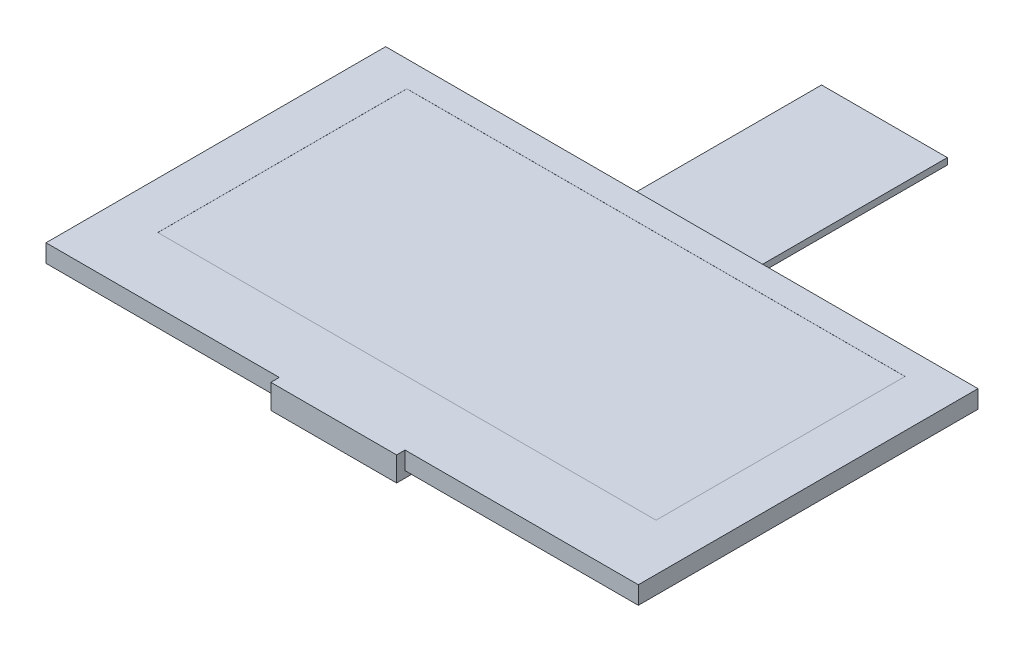
ISO-10303-21;
HEADER;
FILE_DESCRIPTION(('STEP AP214'),'2;1');
FILE_NAME('part.step','',(''),(''),'','','');
FILE_SCHEMA(('AUTOMOTIVE_DESIGN { 1 0 10303 214 1 1 1 1 }'));
ENDSEC;
DATA;
#1=APPLICATION_CONTEXT('core data for automotive mechanical design processes');
#2=APPLICATION_PROTOCOL_DEFINITION('international standard','automotive_design',2000,#1);
#3=PRODUCT_CONTEXT('',#1,'mechanical');
#4=PRODUCT('Part','Part','',(#3));
#5=PRODUCT_RELATED_PRODUCT_CATEGORY('part','',(#4));
#6=PRODUCT_DEFINITION_FORMATION('','',#4);
#7=PRODUCT_DEFINITION_CONTEXT('part definition',#1,'design');
#8=PRODUCT_DEFINITION('design','',#6,#7);
#9=PRODUCT_DEFINITION_SHAPE('','',#8);
#10=(LENGTH_UNIT() NAMED_UNIT(*) SI_UNIT(.MILLI.,.METRE.));
#11=(NAMED_UNIT(*) PLANE_ANGLE_UNIT() SI_UNIT($,.RADIAN.));
#12=(NAMED_UNIT(*) SI_UNIT($,.STERADIAN.) SOLID_ANGLE_UNIT());
#13=UNCERTAINTY_MEASURE_WITH_UNIT(LENGTH_MEASURE(1.E-05),#10,'distance_accuracy_value','');
#14=(GEOMETRIC_REPRESENTATION_CONTEXT(3) GLOBAL_UNCERTAINTY_ASSIGNED_CONTEXT((#13)) GLOBAL_UNIT_ASSIGNED_CONTEXT((#10,
#11,#12)) REPRESENTATION_CONTEXT('',''));
#15=CARTESIAN_POINT('',(0.,0.,0.));
#16=DIRECTION('',(0.,0.,1.));
#17=DIRECTION('',(1.,0.,0.));
#18=AXIS2_PLACEMENT_3D('',#15,#16,#17);
#19=CARTESIAN_POINT('',(7.75000000000001,29.3896393308935,0.));
#20=DIRECTION('',(1.,0.,0.));
#21=DIRECTION('',(0.,0.,-1.));
#22=AXIS2_PLACEMENT_3D('',#19,#20,#21);
#23=PLANE('',#22);
#24=DIRECTION('',(0.,0.,-1.));
#25=VECTOR('',#24,1.);
#26=CARTESIAN_POINT('',(7.75000000000001,0.,0.));
#27=LINE('',#26,#25);
#28=CARTESIAN_POINT('',(7.75000000000001,0.,-20.93));
#29=VERTEX_POINT('',#28);
#30=CARTESIAN_POINT('',(7.75000000000001,0.,-45.9));
#31=VERTEX_POINT('',#30);
#32=EDGE_CURVE('E55',#29,#31,#27,.T.);
#33=ORIENTED_EDGE('',*,*,#32,.F.);
#34=DIRECTION('',(0.,-1.,0.));
#35=VECTOR('',#34,1.);
#36=CARTESIAN_POINT('',(7.75000000000001,29.3896393308935,-20.93));
#37=LINE('',#36,#35);
#38=CARTESIAN_POINT('',(7.75000000000001,-0.8,-20.93));
#39=VERTEX_POINT('',#38);
#40=EDGE_CURVE('E83',#29,#39,#37,.T.);
#41=ORIENTED_EDGE('',*,*,#40,.T.);
#42=DIRECTION('',(0.,0.,1.));
#43=VECTOR('',#42,1.);
#44=CARTESIAN_POINT('',(7.75000000000001,-0.8,0.));
#45=LINE('',#44,#43);
#46=CARTESIAN_POINT('',(7.75000000000001,-0.8,-45.9));
#47=VERTEX_POINT('',#46);
#48=EDGE_CURVE('E87',#47,#39,#45,.T.);
#49=ORIENTED_EDGE('',*,*,#48,.F.);
#50=DIRECTION('',(0.,-1.,0.));
#51=VECTOR('',#50,1.);
#52=CARTESIAN_POINT('',(7.75000000000001,29.3896393308935,-45.9));
#53=LINE('',#52,#51);
#54=EDGE_CURVE('E110',#31,#47,#53,.T.);
#55=ORIENTED_EDGE('',*,*,#54,.F.);
#56=EDGE_LOOP('',(#33,#41,#49,#55));
#57=FACE_BOUND('',#56,.T.);
#58=ADVANCED_FACE('F47',(#57),#23,.T.);
#59=CARTESIAN_POINT('',(0.,29.3896393308935,-45.9));
#60=DIRECTION('',(0.,0.,-1.));
#61=DIRECTION('',(-1.,0.,0.));
#62=AXIS2_PLACEMENT_3D('',#59,#60,#61);
#63=PLANE('',#62);
#64=DIRECTION('',(-1.,0.,0.));
#65=VECTOR('',#64,1.);
#66=CARTESIAN_POINT('',(0.,0.,-45.9));
#67=LINE('',#66,#65);
#68=CARTESIAN_POINT('',(-7.75000000000001,0.,-45.9));
#69=VERTEX_POINT('',#68);
#70=EDGE_CURVE('E61',#31,#69,#67,.T.);
#71=ORIENTED_EDGE('',*,*,#70,.F.);
#72=ORIENTED_EDGE('',*,*,#54,.T.);
#73=DIRECTION('',(1.,0.,0.));
#74=VECTOR('',#73,1.);
#75=CARTESIAN_POINT('',(0.,-0.8,-45.9));
#76=LINE('',#75,#74);
#77=CARTESIAN_POINT('',(-7.75000000000001,-0.8,-45.9));
#78=VERTEX_POINT('',#77);
#79=EDGE_CURVE('E92',#78,#47,#76,.T.);
#80=ORIENTED_EDGE('',*,*,#79,.F.);
#81=DIRECTION('',(0.,-1.,0.));
#82=VECTOR('',#81,1.);
#83=CARTESIAN_POINT('',(-7.75000000000001,29.3896393308935,-45.9));
#84=LINE('',#83,#82);
#85=EDGE_CURVE('E113',#69,#78,#84,.T.);
#86=ORIENTED_EDGE('',*,*,#85,.F.);
#87=EDGE_LOOP('',(#71,#72,#80,#86));
#88=FACE_BOUND('',#87,.T.);
#89=ADVANCED_FACE('F119',(#88),#63,.T.);
#90=CARTESIAN_POINT('',(-7.75000000000001,29.3896393308935,0.));
#91=DIRECTION('',(-1.,0.,0.));
#92=DIRECTION('',(0.,0.,1.));
#93=AXIS2_PLACEMENT_3D('',#90,#91,#92);
#94=PLANE('',#93);
#95=DIRECTION('',(0.,0.,1.));
#96=VECTOR('',#95,1.);
#97=CARTESIAN_POINT('',(-7.75000000000001,0.,0.));
#98=LINE('',#97,#96);
#99=CARTESIAN_POINT('',(-7.75000000000001,0.,-20.93));
#100=VERTEX_POINT('',#99);
#101=EDGE_CURVE('E112',#69,#100,#98,.T.);
#102=ORIENTED_EDGE('',*,*,#101,.F.);
#103=ORIENTED_EDGE('',*,*,#85,.T.);
#104=DIRECTION('',(0.,0.,-1.));
#105=VECTOR('',#104,1.);
#106=CARTESIAN_POINT('',(-7.75000000000001,-0.8,0.));
#107=LINE('',#106,#105);
#108=CARTESIAN_POINT('',(-7.75000000000001,-0.8,-20.93));
#109=VERTEX_POINT('',#108);
#110=EDGE_CURVE('E100',#109,#78,#107,.T.);
#111=ORIENTED_EDGE('',*,*,#110,.F.);
#112=DIRECTION('',(0.,-1.,0.));
#113=VECTOR('',#112,1.);
#114=CARTESIAN_POINT('',(-7.75000000000001,29.3896393308935,-20.93));
#115=LINE('',#114,#113);
#116=EDGE_CURVE('E91',#100,#109,#115,.T.);
#117=ORIENTED_EDGE('',*,*,#116,.F.);
#118=EDGE_LOOP('',(#102,#103,#111,#117));
#119=FACE_BOUND('',#118,.T.);
#120=ADVANCED_FACE('F117',(#119),#94,.T.);
#121=CARTESIAN_POINT('',(0.,29.3896393308935,-20.93));
#122=DIRECTION('',(0.,0.,1.));
#123=DIRECTION('',(1.,0.,0.));
#124=AXIS2_PLACEMENT_3D('',#121,#122,#123);
#125=PLANE('',#124);
#126=DIRECTION('',(1.,0.,0.));
#127=VECTOR('',#126,1.);
#128=CARTESIAN_POINT('',(0.,0.,-20.93));
#129=LINE('',#128,#127);
#130=EDGE_CURVE('E12',#100,#29,#129,.T.);
#131=ORIENTED_EDGE('',*,*,#130,.F.);
#132=ORIENTED_EDGE('',*,*,#116,.T.);
#133=DIRECTION('',(-1.,0.,0.));
#134=VECTOR('',#133,1.);
#135=CARTESIAN_POINT('',(0.,-0.8,-20.93));
#136=LINE('',#135,#134);
#137=EDGE_CURVE('E94',#39,#109,#136,.T.);
#138=ORIENTED_EDGE('',*,*,#137,.F.);
#139=ORIENTED_EDGE('',*,*,#40,.F.);
#140=EDGE_LOOP('',(#131,#132,#138,#139));
#141=FACE_BOUND('',#140,.T.);
#142=ADVANCED_FACE('F95',(#141),#125,.T.);
#143=CARTESIAN_POINT('',(0.,-0.8,0.));
#144=DIRECTION('',(0.,-1.,0.));
#145=DIRECTION('',(0.,0.,-1.));
#146=AXIS2_PLACEMENT_3D('',#143,#144,#145);
#147=PLANE('',#146);
#148=ORIENTED_EDGE('',*,*,#48,.T.);
#149=ORIENTED_EDGE('',*,*,#137,.T.);
#150=ORIENTED_EDGE('',*,*,#110,.T.);
#151=ORIENTED_EDGE('',*,*,#79,.T.);
#152=EDGE_LOOP('',(#148,#149,#150,#151));
#153=FACE_BOUND('',#152,.T.);
#154=ADVANCED_FACE('F102',(#153),#147,.T.);
#155=CARTESIAN_POINT('',(0.,0.,0.));
#156=DIRECTION('',(0.,-1.,0.));
#157=DIRECTION('',(0.,0.,-1.));
#158=AXIS2_PLACEMENT_3D('',#155,#156,#157);
#159=PLANE('',#158);
#160=ORIENTED_EDGE('',*,*,#32,.T.);
#161=ORIENTED_EDGE('',*,*,#70,.T.);
#162=ORIENTED_EDGE('',*,*,#101,.T.);
#163=ORIENTED_EDGE('',*,*,#130,.T.);
#164=EDGE_LOOP('',(#160,#161,#162,#163));
#165=FACE_BOUND('',#164,.T.);
#166=ADVANCED_FACE('F121',(#165),#159,.F.);
#167=CLOSED_SHELL('',(#58,#89,#120,#142,#154,#166));
#168=MANIFOLD_SOLID_BREP('B2',#167);
#169=CARTESIAN_POINT('',(-36.5,2.2,20.93));
#170=DIRECTION('',(0.,0.,-1.));
#171=DIRECTION('',(-1.,0.,0.));
#172=AXIS2_PLACEMENT_3D('',#169,#170,#171);
#173=PLANE('',#172);
#174=DIRECTION('',(0.,-1.,0.));
#175=VECTOR('',#174,1.);
#176=CARTESIAN_POINT('',(-7.75,2.2,20.93));
#177=LINE('',#176,#175);
#178=CARTESIAN_POINT('',(-7.75,2.2,20.93));
#179=VERTEX_POINT('',#178);
#180=CARTESIAN_POINT('',(-7.75,0.,20.93));
#181=VERTEX_POINT('',#180);
#182=EDGE_CURVE('E194',#179,#181,#177,.T.);
#183=ORIENTED_EDGE('',*,*,#182,.F.);
#184=DIRECTION('',(1.,0.,0.));
#185=VECTOR('',#184,1.);
#186=CARTESIAN_POINT('',(-36.5,2.2,20.93));
#187=LINE('',#186,#185);
#188=CARTESIAN_POINT('',(-36.5,2.2,20.93));
#189=VERTEX_POINT('',#188);
#190=EDGE_CURVE('E345',#189,#179,#187,.T.);
#191=ORIENTED_EDGE('',*,*,#190,.F.);
#192=DIRECTION('',(0.,-1.,0.));
#193=VECTOR('',#192,1.);
#194=CARTESIAN_POINT('',(-36.5,2.2,20.93));
#195=LINE('',#194,#193);
#196=CARTESIAN_POINT('',(-36.5,0.,20.93));
#197=VERTEX_POINT('',#196);
#198=EDGE_CURVE('E358',#189,#197,#195,.T.);
#199=ORIENTED_EDGE('',*,*,#198,.T.);
#200=DIRECTION('',(1.,0.,0.));
#201=VECTOR('',#200,1.);
#202=CARTESIAN_POINT('',(-36.5,0.,20.93));
#203=LINE('',#202,#201);
#204=EDGE_CURVE('E341',#197,#181,#203,.T.);
#205=ORIENTED_EDGE('',*,*,#204,.T.);
#206=EDGE_LOOP('',(#183,#191,#199,#205));
#207=FACE_BOUND('',#206,.T.);
#208=ADVANCED_FACE('F171',(#207),#173,.F.);
#209=CARTESIAN_POINT('',(0.,0.,0.));
#210=DIRECTION('',(0.,-1.,0.));
#211=DIRECTION('',(0.,0.,-1.));
#212=AXIS2_PLACEMENT_3D('',#209,#210,#211);
#213=PLANE('',#212);
#214=DIRECTION('',(-1.,0.,0.));
#215=VECTOR('',#214,1.);
#216=CARTESIAN_POINT('',(0.,0.,19.89));
#217=LINE('',#216,#215);
#218=CARTESIAN_POINT('',(7.75,0.,19.89));
#219=VERTEX_POINT('',#218);
#220=CARTESIAN_POINT('',(-7.75,0.,19.89));
#221=VERTEX_POINT('',#220);
#222=EDGE_CURVE('E179',#219,#221,#217,.T.);
#223=ORIENTED_EDGE('',*,*,#222,.T.);
#224=DIRECTION('',(0.,0.,1.));
#225=VECTOR('',#224,1.);
#226=CARTESIAN_POINT('',(-7.75,0.,0.));
#227=LINE('',#226,#225);
#228=EDGE_CURVE('E45',#221,#181,#227,.T.);
#229=ORIENTED_EDGE('',*,*,#228,.T.);
#230=ORIENTED_EDGE('',*,*,#204,.F.);
#231=DIRECTION('',(0.,0.,1.));
#232=VECTOR('',#231,1.);
#233=CARTESIAN_POINT('',(-36.5,0.,20.93));
#234=LINE('',#233,#232);
#235=CARTESIAN_POINT('',(-36.5,0.,-20.93));
#236=VERTEX_POINT('',#235);
#237=EDGE_CURVE('E352',#236,#197,#234,.T.);
#238=ORIENTED_EDGE('',*,*,#237,.F.);
#239=DIRECTION('',(-1.,0.,0.));
#240=VECTOR('',#239,1.);
#241=CARTESIAN_POINT('',(-36.5,0.,-20.93));
#242=LINE('',#241,#240);
#243=CARTESIAN_POINT('',(36.5,0.,-20.93));
#244=VERTEX_POINT('',#243);
#245=EDGE_CURVE('E350',#244,#236,#242,.T.);
#246=ORIENTED_EDGE('',*,*,#245,.F.);
#247=DIRECTION('',(0.,0.,-1.));
#248=VECTOR('',#247,1.);
#249=CARTESIAN_POINT('',(36.5,0.,20.93));
#250=LINE('',#249,#248);
#251=CARTESIAN_POINT('',(36.5,0.,20.93));
#252=VERTEX_POINT('',#251);
#253=EDGE_CURVE('E330',#252,#244,#250,.T.);
#254=ORIENTED_EDGE('',*,*,#253,.F.);
#255=CARTESIAN_POINT('',(7.75,0.,20.93));
#256=VERTEX_POINT('',#255);
#257=EDGE_CURVE('E354',#256,#252,#203,.T.);
#258=ORIENTED_EDGE('',*,*,#257,.F.);
#259=DIRECTION('',(0.,0.,1.));
#260=VECTOR('',#259,1.);
#261=CARTESIAN_POINT('',(7.75000000000001,0.,0.));
#262=LINE('',#261,#260);
#263=EDGE_CURVE('E367',#219,#256,#262,.T.);
#264=ORIENTED_EDGE('',*,*,#263,.F.);
#265=EDGE_LOOP('',(#223,#229,#230,#238,#246,#254,#258,#264));
#266=FACE_BOUND('',#265,.T.);
#267=ADVANCED_FACE('F370',(#266),#213,.T.);
#268=CARTESIAN_POINT('',(36.5,2.2,20.93));
#269=DIRECTION('',(-1.,0.,0.));
#270=DIRECTION('',(0.,0.,1.));
#271=AXIS2_PLACEMENT_3D('',#268,#269,#270);
#272=PLANE('',#271);
#273=ORIENTED_EDGE('',*,*,#253,.T.);
#274=DIRECTION('',(0.,-1.,0.));
#275=VECTOR('',#274,1.);
#276=CARTESIAN_POINT('',(36.5,2.2,-20.93));
#277=LINE('',#276,#275);
#278=CARTESIAN_POINT('',(36.5,2.2,-20.93));
#279=VERTEX_POINT('',#278);
#280=EDGE_CURVE('E364',#279,#244,#277,.T.);
#281=ORIENTED_EDGE('',*,*,#280,.F.);
#282=DIRECTION('',(0.,0.,-1.));
#283=VECTOR('',#282,1.);
#284=CARTESIAN_POINT('',(36.5,2.2,20.93));
#285=LINE('',#284,#283);
#286=CARTESIAN_POINT('',(36.5,2.2,20.93));
#287=VERTEX_POINT('',#286);
#288=EDGE_CURVE('E337',#287,#279,#285,.T.);
#289=ORIENTED_EDGE('',*,*,#288,.F.);
#290=DIRECTION('',(0.,-1.,0.));
#291=VECTOR('',#290,1.);
#292=CARTESIAN_POINT('',(36.5,2.2,20.93));
#293=LINE('',#292,#291);
#294=EDGE_CURVE('E347',#287,#252,#293,.T.);
#295=ORIENTED_EDGE('',*,*,#294,.T.);
#296=EDGE_LOOP('',(#273,#281,#289,#295));
#297=FACE_BOUND('',#296,.T.);
#298=ADVANCED_FACE('F173',(#297),#272,.F.);
#299=CARTESIAN_POINT('',(-36.5,2.2,-20.93));
#300=DIRECTION('',(0.,0.,1.));
#301=DIRECTION('',(1.,0.,0.));
#302=AXIS2_PLACEMENT_3D('',#299,#300,#301);
#303=PLANE('',#302);
#304=ORIENTED_EDGE('',*,*,#245,.T.);
#305=DIRECTION('',(0.,-1.,0.));
#306=VECTOR('',#305,1.);
#307=CARTESIAN_POINT('',(-36.5,2.2,-20.93));
#308=LINE('',#307,#306);
#309=CARTESIAN_POINT('',(-36.5,2.2,-20.93));
#310=VERTEX_POINT('',#309);
#311=EDGE_CURVE('E361',#310,#236,#308,.T.);
#312=ORIENTED_EDGE('',*,*,#311,.F.);
#313=DIRECTION('',(-1.,0.,0.));
#314=VECTOR('',#313,1.);
#315=CARTESIAN_POINT('',(-36.5,2.2,-20.93));
#316=LINE('',#315,#314);
#317=EDGE_CURVE('E340',#279,#310,#316,.T.);
#318=ORIENTED_EDGE('',*,*,#317,.F.);
#319=ORIENTED_EDGE('',*,*,#280,.T.);
#320=EDGE_LOOP('',(#304,#312,#318,#319));
#321=FACE_BOUND('',#320,.T.);
#322=ADVANCED_FACE('F402',(#321),#303,.F.);
#323=CARTESIAN_POINT('',(-36.5,2.2,20.93));
#324=DIRECTION('',(1.,0.,0.));
#325=DIRECTION('',(0.,0.,-1.));
#326=AXIS2_PLACEMENT_3D('',#323,#324,#325);
#327=PLANE('',#326);
#328=ORIENTED_EDGE('',*,*,#237,.T.);
#329=ORIENTED_EDGE('',*,*,#198,.F.);
#330=DIRECTION('',(0.,0.,1.));
#331=VECTOR('',#330,1.);
#332=CARTESIAN_POINT('',(-36.5,2.2,20.93));
#333=LINE('',#332,#331);
#334=EDGE_CURVE('E343',#310,#189,#333,.T.);
#335=ORIENTED_EDGE('',*,*,#334,.F.);
#336=ORIENTED_EDGE('',*,*,#311,.T.);
#337=EDGE_LOOP('',(#328,#329,#335,#336));
#338=FACE_BOUND('',#337,.T.);
#339=ADVANCED_FACE('F399',(#338),#327,.F.);
#340=CARTESIAN_POINT('',(7.75,2.2,20.93));
#341=VERTEX_POINT('',#340);
#342=EDGE_CURVE('E186',#341,#287,#187,.T.);
#343=ORIENTED_EDGE('',*,*,#342,.F.);
#344=DIRECTION('',(0.,-1.,0.));
#345=VECTOR('',#344,1.);
#346=CARTESIAN_POINT('',(7.75,2.2,20.93));
#347=LINE('',#346,#345);
#348=EDGE_CURVE('E298',#341,#256,#347,.T.);
#349=ORIENTED_EDGE('',*,*,#348,.T.);
#350=ORIENTED_EDGE('',*,*,#257,.T.);
#351=ORIENTED_EDGE('',*,*,#294,.F.);
#352=EDGE_LOOP('',(#343,#349,#350,#351));
#353=FACE_BOUND('',#352,.T.);
#354=ADVANCED_FACE('F406',(#353),#173,.F.);
#355=CARTESIAN_POINT('',(0.,2.2,0.));
#356=DIRECTION('',(0.,-1.,0.));
#357=DIRECTION('',(0.,0.,-1.));
#358=AXIS2_PLACEMENT_3D('',#355,#356,#357);
#359=PLANE('',#358);
#360=ORIENTED_EDGE('',*,*,#190,.T.);
#361=DIRECTION('',(0.,0.,-1.));
#362=VECTOR('',#361,1.);
#363=CARTESIAN_POINT('',(-7.75,2.2,21.97));
#364=LINE('',#363,#362);
#365=CARTESIAN_POINT('',(-7.75,2.2,21.97));
#366=VERTEX_POINT('',#365);
#367=EDGE_CURVE('E379',#366,#179,#364,.T.);
#368=ORIENTED_EDGE('',*,*,#367,.F.);
#369=DIRECTION('',(1.,0.,0.));
#370=VECTOR('',#369,1.);
#371=CARTESIAN_POINT('',(-7.75,2.2,21.97));
#372=LINE('',#371,#370);
#373=CARTESIAN_POINT('',(7.75,2.2,21.97));
#374=VERTEX_POINT('',#373);
#375=EDGE_CURVE('E294',#366,#374,#372,.T.);
#376=ORIENTED_EDGE('',*,*,#375,.T.);
#377=DIRECTION('',(0.,0.,-1.));
#378=VECTOR('',#377,1.);
#379=CARTESIAN_POINT('',(7.75,2.2,21.97));
#380=LINE('',#379,#378);
#381=EDGE_CURVE('E382',#374,#341,#380,.T.);
#382=ORIENTED_EDGE('',*,*,#381,.T.);
#383=ORIENTED_EDGE('',*,*,#342,.T.);
#384=ORIENTED_EDGE('',*,*,#288,.T.);
#385=ORIENTED_EDGE('',*,*,#317,.T.);
#386=ORIENTED_EDGE('',*,*,#334,.T.);
#387=EDGE_LOOP('',(#360,#368,#376,#382,#383,#384,#385,#386));
#388=FACE_BOUND('',#387,.T.);
#389=DIRECTION('',(0.,0.,-1.));
#390=VECTOR('',#389,1.);
#391=CARTESIAN_POINT('',(30.705,2.2,12.95));
#392=LINE('',#391,#390);
#393=CARTESIAN_POINT('',(30.705,2.2,12.95));
#394=VERTEX_POINT('',#393);
#395=CARTESIAN_POINT('',(30.705,2.2,-17.74));
#396=VERTEX_POINT('',#395);
#397=EDGE_CURVE('E320',#394,#396,#392,.T.);
#398=ORIENTED_EDGE('',*,*,#397,.F.);
#399=DIRECTION('',(1.,0.,0.));
#400=VECTOR('',#399,1.);
#401=CARTESIAN_POINT('',(-30.705,2.2,12.95));
#402=LINE('',#401,#400);
#403=CARTESIAN_POINT('',(-30.705,2.2,12.95));
#404=VERTEX_POINT('',#403);
#405=EDGE_CURVE('E306',#404,#394,#402,.T.);
#406=ORIENTED_EDGE('',*,*,#405,.F.);
#407=DIRECTION('',(0.,0.,-1.));
#408=VECTOR('',#407,1.);
#409=CARTESIAN_POINT('',(-30.705,2.2,12.95));
#410=LINE('',#409,#408);
#411=CARTESIAN_POINT('',(-30.705,2.2,-17.74));
#412=VERTEX_POINT('',#411);
#413=EDGE_CURVE('E311',#404,#412,#410,.T.);
#414=ORIENTED_EDGE('',*,*,#413,.T.);
#415=DIRECTION('',(1.,0.,0.));
#416=VECTOR('',#415,1.);
#417=CARTESIAN_POINT('',(-30.705,2.2,-17.74));
#418=LINE('',#417,#416);
#419=EDGE_CURVE('E323',#412,#396,#418,.T.);
#420=ORIENTED_EDGE('',*,*,#419,.T.);
#421=EDGE_LOOP('',(#398,#406,#414,#420));
#422=FACE_BOUND('',#421,.T.);
#423=ADVANCED_FACE('F392',(#388,#422),#359,.F.);
#424=CARTESIAN_POINT('',(-30.705,2.19,12.95));
#425=DIRECTION('',(0.,0.,1.));
#426=DIRECTION('',(1.,0.,0.));
#427=AXIS2_PLACEMENT_3D('',#424,#425,#426);
#428=PLANE('',#427);
#429=ORIENTED_EDGE('',*,*,#405,.T.);
#430=DIRECTION('',(0.,1.,0.));
#431=VECTOR('',#430,1.);
#432=CARTESIAN_POINT('',(30.705,2.19,12.95));
#433=LINE('',#432,#431);
#434=CARTESIAN_POINT('',(30.705,2.19,12.95));
#435=VERTEX_POINT('',#434);
#436=EDGE_CURVE('E318',#435,#394,#433,.T.);
#437=ORIENTED_EDGE('',*,*,#436,.F.);
#438=DIRECTION('',(1.,0.,0.));
#439=VECTOR('',#438,1.);
#440=CARTESIAN_POINT('',(-30.705,2.19,12.95));
#441=LINE('',#440,#439);
#442=CARTESIAN_POINT('',(-30.705,2.19,12.95));
#443=VERTEX_POINT('',#442);
#444=EDGE_CURVE('E307',#443,#435,#441,.T.);
#445=ORIENTED_EDGE('',*,*,#444,.F.);
#446=DIRECTION('',(0.,1.,0.));
#447=VECTOR('',#446,1.);
#448=CARTESIAN_POINT('',(-30.705,2.19,12.95));
#449=LINE('',#448,#447);
#450=EDGE_CURVE('E328',#443,#404,#449,.T.);
#451=ORIENTED_EDGE('',*,*,#450,.T.);
#452=EDGE_LOOP('',(#429,#437,#445,#451));
#453=FACE_BOUND('',#452,.T.);
#454=ADVANCED_FACE('F413',(#453),#428,.F.);
#455=CARTESIAN_POINT('',(-30.705,2.19,12.95));
#456=DIRECTION('',(1.,0.,0.));
#457=DIRECTION('',(0.,0.,-1.));
#458=AXIS2_PLACEMENT_3D('',#455,#456,#457);
#459=PLANE('',#458);
#460=ORIENTED_EDGE('',*,*,#413,.F.);
#461=ORIENTED_EDGE('',*,*,#450,.F.);
#462=DIRECTION('',(0.,0.,-1.));
#463=VECTOR('',#462,1.);
#464=CARTESIAN_POINT('',(-30.705,2.19,12.95));
#465=LINE('',#464,#463);
#466=CARTESIAN_POINT('',(-30.705,2.19,-17.74));
#467=VERTEX_POINT('',#466);
#468=EDGE_CURVE('E316',#443,#467,#465,.T.);
#469=ORIENTED_EDGE('',*,*,#468,.T.);
#470=DIRECTION('',(0.,1.,0.));
#471=VECTOR('',#470,1.);
#472=CARTESIAN_POINT('',(-30.705,2.19,-17.74));
#473=LINE('',#472,#471);
#474=EDGE_CURVE('E331',#467,#412,#473,.T.);
#475=ORIENTED_EDGE('',*,*,#474,.T.);
#476=EDGE_LOOP('',(#460,#461,#469,#475));
#477=FACE_BOUND('',#476,.T.);
#478=ADVANCED_FACE('F427',(#477),#459,.T.);
#479=CARTESIAN_POINT('',(-30.705,2.19,-17.74));
#480=DIRECTION('',(0.,0.,1.));
#481=DIRECTION('',(1.,0.,0.));
#482=AXIS2_PLACEMENT_3D('',#479,#480,#481);
#483=PLANE('',#482);
#484=ORIENTED_EDGE('',*,*,#419,.F.);
#485=ORIENTED_EDGE('',*,*,#474,.F.);
#486=DIRECTION('',(1.,0.,0.));
#487=VECTOR('',#486,1.);
#488=CARTESIAN_POINT('',(-30.705,2.19,-17.74));
#489=LINE('',#488,#487);
#490=CARTESIAN_POINT('',(30.705,2.19,-17.74));
#491=VERTEX_POINT('',#490);
#492=EDGE_CURVE('E314',#467,#491,#489,.T.);
#493=ORIENTED_EDGE('',*,*,#492,.T.);
#494=DIRECTION('',(0.,1.,0.));
#495=VECTOR('',#494,1.);
#496=CARTESIAN_POINT('',(30.705,2.19,-17.74));
#497=LINE('',#496,#495);
#498=EDGE_CURVE('E333',#491,#396,#497,.T.);
#499=ORIENTED_EDGE('',*,*,#498,.T.);
#500=EDGE_LOOP('',(#484,#485,#493,#499));
#501=FACE_BOUND('',#500,.T.);
#502=ADVANCED_FACE('F433',(#501),#483,.T.);
#503=CARTESIAN_POINT('',(30.705,2.19,12.95));
#504=DIRECTION('',(1.,0.,0.));
#505=DIRECTION('',(0.,0.,-1.));
#506=AXIS2_PLACEMENT_3D('',#503,#504,#505);
#507=PLANE('',#506);
#508=ORIENTED_EDGE('',*,*,#397,.T.);
#509=ORIENTED_EDGE('',*,*,#498,.F.);
#510=DIRECTION('',(0.,0.,-1.));
#511=VECTOR('',#510,1.);
#512=CARTESIAN_POINT('',(30.705,2.19,12.95));
#513=LINE('',#512,#511);
#514=EDGE_CURVE('E310',#435,#491,#513,.T.);
#515=ORIENTED_EDGE('',*,*,#514,.F.);
#516=ORIENTED_EDGE('',*,*,#436,.T.);
#517=EDGE_LOOP('',(#508,#509,#515,#516));
#518=FACE_BOUND('',#517,.T.);
#519=ADVANCED_FACE('F429',(#518),#507,.F.);
#520=CARTESIAN_POINT('',(0.,2.19,0.));
#521=DIRECTION('',(0.,1.,0.));
#522=DIRECTION('',(0.,0.,1.));
#523=AXIS2_PLACEMENT_3D('',#520,#521,#522);
#524=PLANE('',#523);
#525=ORIENTED_EDGE('',*,*,#444,.T.);
#526=ORIENTED_EDGE('',*,*,#514,.T.);
#527=ORIENTED_EDGE('',*,*,#492,.F.);
#528=ORIENTED_EDGE('',*,*,#468,.F.);
#529=EDGE_LOOP('',(#525,#526,#527,#528));
#530=FACE_BOUND('',#529,.T.);
#531=ADVANCED_FACE('F432',(#530),#524,.T.);
#532=CARTESIAN_POINT('',(-7.75,-0.8,21.97));
#533=DIRECTION('',(1.,0.,0.));
#534=DIRECTION('',(0.,0.,-1.));
#535=AXIS2_PLACEMENT_3D('',#532,#533,#534);
#536=PLANE('',#535);
#537=DIRECTION('',(0.,1.,0.));
#538=VECTOR('',#537,1.);
#539=CARTESIAN_POINT('',(-7.75,-0.8,21.97));
#540=LINE('',#539,#538);
#541=CARTESIAN_POINT('',(-7.75,-0.8,21.97));
#542=VERTEX_POINT('',#541);
#543=EDGE_CURVE('E376',#542,#366,#540,.T.);
#544=ORIENTED_EDGE('',*,*,#543,.T.);
#545=ORIENTED_EDGE('',*,*,#367,.T.);
#546=ORIENTED_EDGE('',*,*,#182,.T.);
#547=ORIENTED_EDGE('',*,*,#228,.F.);
#548=DIRECTION('',(0.,1.,0.));
#549=VECTOR('',#548,1.);
#550=CARTESIAN_POINT('',(-7.75,-0.8,19.89));
#551=LINE('',#550,#549);
#552=CARTESIAN_POINT('',(-7.75,-0.8,19.89));
#553=VERTEX_POINT('',#552);
#554=EDGE_CURVE('E279',#553,#221,#551,.T.);
#555=ORIENTED_EDGE('',*,*,#554,.F.);
#556=DIRECTION('',(0.,0.,-1.));
#557=VECTOR('',#556,1.);
#558=CARTESIAN_POINT('',(-7.75,-0.8,21.97));
#559=LINE('',#558,#557);
#560=EDGE_CURVE('E286',#542,#553,#559,.T.);
#561=ORIENTED_EDGE('',*,*,#560,.F.);
#562=EDGE_LOOP('',(#544,#545,#546,#547,#555,#561));
#563=FACE_BOUND('',#562,.T.);
#564=ADVANCED_FACE('F297',(#563),#536,.F.);
#565=CARTESIAN_POINT('',(7.75,-0.8,21.97));
#566=DIRECTION('',(1.,0.,0.));
#567=DIRECTION('',(0.,0.,-1.));
#568=AXIS2_PLACEMENT_3D('',#565,#566,#567);
#569=PLANE('',#568);
#570=ORIENTED_EDGE('',*,*,#263,.T.);
#571=ORIENTED_EDGE('',*,*,#348,.F.);
#572=ORIENTED_EDGE('',*,*,#381,.F.);
#573=DIRECTION('',(0.,1.,0.));
#574=VECTOR('',#573,1.);
#575=CARTESIAN_POINT('',(7.75,-0.8,21.97));
#576=LINE('',#575,#574);
#577=CARTESIAN_POINT('',(7.75,-0.8,21.97));
#578=VERTEX_POINT('',#577);
#579=EDGE_CURVE('E301',#578,#374,#576,.T.);
#580=ORIENTED_EDGE('',*,*,#579,.F.);
#581=DIRECTION('',(0.,0.,-1.));
#582=VECTOR('',#581,1.);
#583=CARTESIAN_POINT('',(7.75,-0.8,21.97));
#584=LINE('',#583,#582);
#585=CARTESIAN_POINT('',(7.75,-0.8,19.89));
#586=VERTEX_POINT('',#585);
#587=EDGE_CURVE('E285',#578,#586,#584,.T.);
#588=ORIENTED_EDGE('',*,*,#587,.T.);
#589=DIRECTION('',(0.,1.,0.));
#590=VECTOR('',#589,1.);
#591=CARTESIAN_POINT('',(7.75,-0.8,19.89));
#592=LINE('',#591,#590);
#593=EDGE_CURVE('E281',#586,#219,#592,.T.);
#594=ORIENTED_EDGE('',*,*,#593,.T.);
#595=EDGE_LOOP('',(#570,#571,#572,#580,#588,#594));
#596=FACE_BOUND('',#595,.T.);
#597=ADVANCED_FACE('F373',(#596),#569,.T.);
#598=CARTESIAN_POINT('',(-7.75,-0.8,19.89));
#599=DIRECTION('',(0.,0.,1.));
#600=DIRECTION('',(1.,0.,0.));
#601=AXIS2_PLACEMENT_3D('',#598,#599,#600);
#602=PLANE('',#601);
#603=ORIENTED_EDGE('',*,*,#222,.F.);
#604=ORIENTED_EDGE('',*,*,#593,.F.);
#605=DIRECTION('',(1.,0.,0.));
#606=VECTOR('',#605,1.);
#607=CARTESIAN_POINT('',(-7.75,-0.8,19.89));
#608=LINE('',#607,#606);
#609=EDGE_CURVE('E274',#553,#586,#608,.T.);
#610=ORIENTED_EDGE('',*,*,#609,.F.);
#611=ORIENTED_EDGE('',*,*,#554,.T.);
#612=EDGE_LOOP('',(#603,#604,#610,#611));
#613=FACE_BOUND('',#612,.T.);
#614=ADVANCED_FACE('F277',(#613),#602,.F.);
#615=CARTESIAN_POINT('',(-7.75,-0.8,21.97));
#616=DIRECTION('',(0.,0.,1.));
#617=DIRECTION('',(1.,0.,0.));
#618=AXIS2_PLACEMENT_3D('',#615,#616,#617);
#619=PLANE('',#618);
#620=ORIENTED_EDGE('',*,*,#579,.T.);
#621=ORIENTED_EDGE('',*,*,#375,.F.);
#622=ORIENTED_EDGE('',*,*,#543,.F.);
#623=DIRECTION('',(1.,0.,0.));
#624=VECTOR('',#623,1.);
#625=CARTESIAN_POINT('',(-7.75,-0.8,21.97));
#626=LINE('',#625,#624);
#627=EDGE_CURVE('E292',#542,#578,#626,.T.);
#628=ORIENTED_EDGE('',*,*,#627,.T.);
#629=EDGE_LOOP('',(#620,#621,#622,#628));
#630=FACE_BOUND('',#629,.T.);
#631=ADVANCED_FACE('F389',(#630),#619,.T.);
#632=CARTESIAN_POINT('',(0.,-0.8,0.));
#633=DIRECTION('',(0.,-1.,0.));
#634=DIRECTION('',(0.,0.,-1.));
#635=AXIS2_PLACEMENT_3D('',#632,#633,#634);
#636=PLANE('',#635);
#637=ORIENTED_EDGE('',*,*,#560,.T.);
#638=ORIENTED_EDGE('',*,*,#609,.T.);
#639=ORIENTED_EDGE('',*,*,#587,.F.);
#640=ORIENTED_EDGE('',*,*,#627,.F.);
#641=EDGE_LOOP('',(#637,#638,#639,#640));
#642=FACE_BOUND('',#641,.T.);
#643=ADVANCED_FACE('F290',(#642),#636,.T.);
#644=CLOSED_SHELL('',(#208,#267,#298,#322,#339,#354,#423,#454,#478,#502,#519,#531,#564,#597,
#614,#631,#643));
#645=MANIFOLD_SOLID_BREP('B6',#644);
#646=ADVANCED_BREP_SHAPE_REPRESENTATION('',(#18,#168,#645),#14);
#647=SHAPE_DEFINITION_REPRESENTATION(#9,#646);
ENDSEC;
END-ISO-10303-21;
